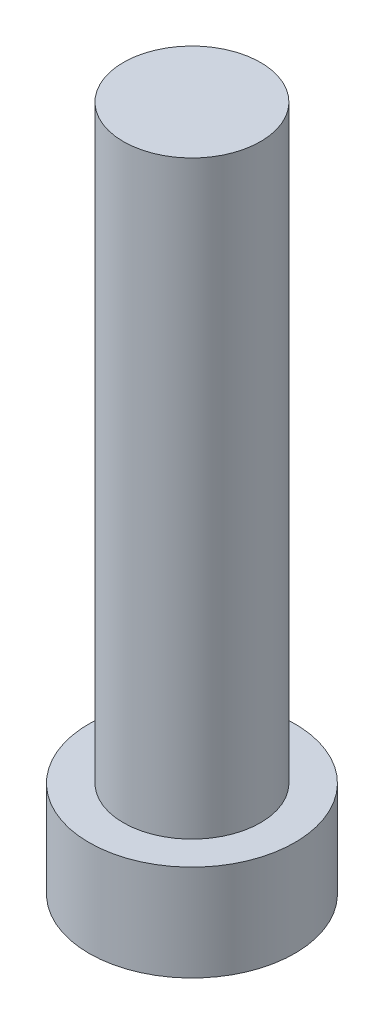
ISO-10303-21;
HEADER;
FILE_DESCRIPTION(('STEP AP214'),'2;1');
FILE_NAME('part.step','',(''),(''),'','','');
FILE_SCHEMA(('AUTOMOTIVE_DESIGN { 1 0 10303 214 1 1 1 1 }'));
ENDSEC;
DATA;
#1=APPLICATION_CONTEXT('core data for automotive mechanical design processes');
#2=APPLICATION_PROTOCOL_DEFINITION('international standard','automotive_design',2000,#1);
#3=PRODUCT_CONTEXT('',#1,'mechanical');
#4=PRODUCT('Part','Part','',(#3));
#5=PRODUCT_RELATED_PRODUCT_CATEGORY('part','',(#4));
#6=PRODUCT_DEFINITION_FORMATION('','',#4);
#7=PRODUCT_DEFINITION_CONTEXT('part definition',#1,'design');
#8=PRODUCT_DEFINITION('design','',#6,#7);
#9=PRODUCT_DEFINITION_SHAPE('','',#8);
#10=(LENGTH_UNIT() NAMED_UNIT(*) SI_UNIT(.MILLI.,.METRE.));
#11=(NAMED_UNIT(*) PLANE_ANGLE_UNIT() SI_UNIT($,.RADIAN.));
#12=(NAMED_UNIT(*) SI_UNIT($,.STERADIAN.) SOLID_ANGLE_UNIT());
#13=UNCERTAINTY_MEASURE_WITH_UNIT(LENGTH_MEASURE(1.E-05),#10,'distance_accuracy_value','');
#14=(GEOMETRIC_REPRESENTATION_CONTEXT(3) GLOBAL_UNCERTAINTY_ASSIGNED_CONTEXT((#13)) GLOBAL_UNIT_ASSIGNED_CONTEXT((#10,
#11,#12)) REPRESENTATION_CONTEXT('',''));
#15=CARTESIAN_POINT('',(0.,0.,0.));
#16=DIRECTION('',(0.,0.,1.));
#17=DIRECTION('',(1.,0.,0.));
#18=AXIS2_PLACEMENT_3D('',#15,#16,#17);
#19=CARTESIAN_POINT('',(0.,7.,0.));
#20=DIRECTION('',(0.,1.,0.));
#21=DIRECTION('',(0.,0.,1.));
#22=AXIS2_PLACEMENT_3D('',#19,#20,#21);
#23=PLANE('',#22);
#24=CARTESIAN_POINT('',(0.,7.,0.));
#25=DIRECTION('',(0.,1.,0.));
#26=DIRECTION('',(0.,0.,1.));
#27=AXIS2_PLACEMENT_3D('',#24,#25,#26);
#28=CIRCLE('',#27,7.5);
#29=CARTESIAN_POINT('',(0.,7.,7.5));
#30=VERTEX_POINT('',#29);
#31=EDGE_CURVE('E10',#30,#30,#28,.T.);
#32=ORIENTED_EDGE('',*,*,#31,.T.);
#33=EDGE_LOOP('',(#32));
#34=FACE_BOUND('',#33,.T.);
#35=CARTESIAN_POINT('',(0.,7.,0.));
#36=DIRECTION('',(0.,1.,0.));
#37=DIRECTION('',(0.,0.,1.));
#38=AXIS2_PLACEMENT_3D('',#35,#36,#37);
#39=CIRCLE('',#38,5.);
#40=CARTESIAN_POINT('',(0.,7.,5.));
#41=VERTEX_POINT('',#40);
#42=EDGE_CURVE('E44',#41,#41,#39,.T.);
#43=ORIENTED_EDGE('',*,*,#42,.F.);
#44=EDGE_LOOP('',(#43));
#45=FACE_BOUND('',#44,.T.);
#46=ADVANCED_FACE('F33',(#34,#45),#23,.T.);
#47=CARTESIAN_POINT('',(0.,0.,0.));
#48=DIRECTION('',(0.,1.,0.));
#49=DIRECTION('',(0.,0.,1.));
#50=AXIS2_PLACEMENT_3D('',#47,#48,#49);
#51=PLANE('',#50);
#52=CARTESIAN_POINT('',(0.,0.,0.));
#53=DIRECTION('',(0.,1.,0.));
#54=DIRECTION('',(0.,0.,1.));
#55=AXIS2_PLACEMENT_3D('',#52,#53,#54);
#56=CIRCLE('',#55,7.5);
#57=CARTESIAN_POINT('',(0.,0.,7.5));
#58=VERTEX_POINT('',#57);
#59=EDGE_CURVE('E37',#58,#58,#56,.T.);
#60=ORIENTED_EDGE('',*,*,#59,.F.);
#61=EDGE_LOOP('',(#60));
#62=FACE_BOUND('',#61,.T.);
#63=ADVANCED_FACE('F63',(#62),#51,.F.);
#64=CARTESIAN_POINT('',(0.,7.,0.));
#65=DIRECTION('',(0.,-1.,0.));
#66=DIRECTION('',(0.,0.,-1.));
#67=AXIS2_PLACEMENT_3D('',#64,#65,#66);
#68=CYLINDRICAL_SURFACE('',#67,7.5);
#69=ORIENTED_EDGE('',*,*,#31,.F.);
#70=EDGE_LOOP('',(#69));
#71=FACE_BOUND('',#70,.T.);
#72=ORIENTED_EDGE('',*,*,#59,.T.);
#73=EDGE_LOOP('',(#72));
#74=FACE_BOUND('',#73,.T.);
#75=ADVANCED_FACE('F35',(#71,#74),#68,.T.);
#76=CARTESIAN_POINT('',(0.,50.,0.));
#77=DIRECTION('',(0.,-1.,0.));
#78=DIRECTION('',(0.,0.,-1.));
#79=AXIS2_PLACEMENT_3D('',#76,#77,#78);
#80=CYLINDRICAL_SURFACE('',#79,5.);
#81=ORIENTED_EDGE('',*,*,#42,.T.);
#82=EDGE_LOOP('',(#81));
#83=FACE_BOUND('',#82,.T.);
#84=CARTESIAN_POINT('',(0.,50.,0.));
#85=DIRECTION('',(0.,1.,0.));
#86=DIRECTION('',(0.,0.,1.));
#87=AXIS2_PLACEMENT_3D('',#84,#85,#86);
#88=CIRCLE('',#87,5.);
#89=CARTESIAN_POINT('',(0.,50.,5.));
#90=VERTEX_POINT('',#89);
#91=EDGE_CURVE('E48',#90,#90,#88,.T.);
#92=ORIENTED_EDGE('',*,*,#91,.F.);
#93=EDGE_LOOP('',(#92));
#94=FACE_BOUND('',#93,.T.);
#95=ADVANCED_FACE('F54',(#83,#94),#80,.T.);
#96=CARTESIAN_POINT('',(0.,50.,0.));
#97=DIRECTION('',(0.,1.,0.));
#98=DIRECTION('',(0.,0.,1.));
#99=AXIS2_PLACEMENT_3D('',#96,#97,#98);
#100=PLANE('',#99);
#101=ORIENTED_EDGE('',*,*,#91,.T.);
#102=EDGE_LOOP('',(#101));
#103=FACE_BOUND('',#102,.T.);
#104=ADVANCED_FACE('F52',(#103),#100,.T.);
#105=CLOSED_SHELL('',(#46,#63,#75,#95,#104));
#106=MANIFOLD_SOLID_BREP('B2',#105);
#107=ADVANCED_BREP_SHAPE_REPRESENTATION('',(#18,#106),#14);
#108=SHAPE_DEFINITION_REPRESENTATION(#9,#107);
ENDSEC;
END-ISO-10303-21;
